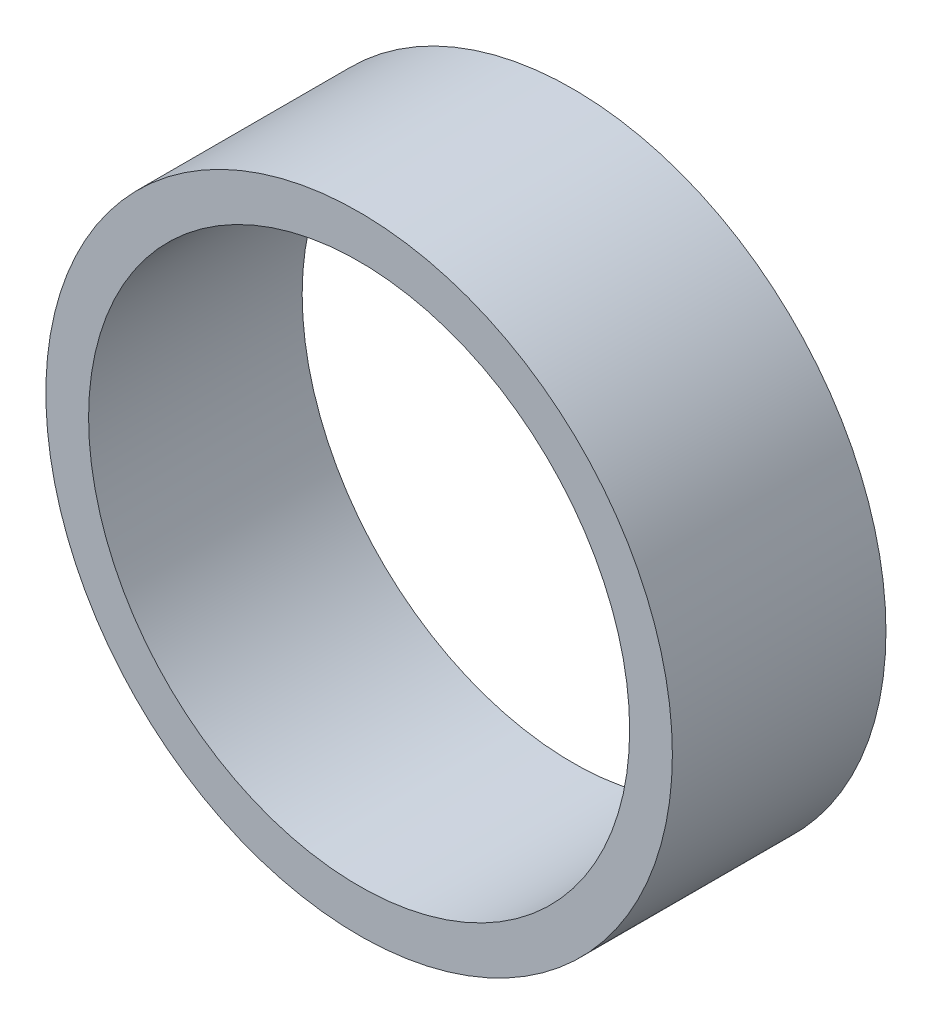
ISO-10303-21;
HEADER;
FILE_DESCRIPTION(('STEP AP214'),'2;1');
FILE_NAME('part.step','',(''),(''),'','','');
FILE_SCHEMA(('AUTOMOTIVE_DESIGN { 1 0 10303 214 1 1 1 1 }'));
ENDSEC;
DATA;
#1=APPLICATION_CONTEXT('core data for automotive mechanical design processes');
#2=APPLICATION_PROTOCOL_DEFINITION('international standard','automotive_design',2000,#1);
#3=PRODUCT_CONTEXT('',#1,'mechanical');
#4=PRODUCT('Part','Part','',(#3));
#5=PRODUCT_RELATED_PRODUCT_CATEGORY('part','',(#4));
#6=PRODUCT_DEFINITION_FORMATION('','',#4);
#7=PRODUCT_DEFINITION_CONTEXT('part definition',#1,'design');
#8=PRODUCT_DEFINITION('design','',#6,#7);
#9=PRODUCT_DEFINITION_SHAPE('','',#8);
#10=(LENGTH_UNIT() NAMED_UNIT(*) SI_UNIT(.MILLI.,.METRE.));
#11=(NAMED_UNIT(*) PLANE_ANGLE_UNIT() SI_UNIT($,.RADIAN.));
#12=(NAMED_UNIT(*) SI_UNIT($,.STERADIAN.) SOLID_ANGLE_UNIT());
#13=UNCERTAINTY_MEASURE_WITH_UNIT(LENGTH_MEASURE(1.E-05),#10,'distance_accuracy_value','');
#14=(GEOMETRIC_REPRESENTATION_CONTEXT(3) GLOBAL_UNCERTAINTY_ASSIGNED_CONTEXT((#13)) GLOBAL_UNIT_ASSIGNED_CONTEXT((#10,
#11,#12)) REPRESENTATION_CONTEXT('',''));
#15=CARTESIAN_POINT('',(0.,0.,0.));
#16=DIRECTION('',(0.,0.,1.));
#17=DIRECTION('',(1.,0.,0.));
#18=AXIS2_PLACEMENT_3D('',#15,#16,#17);
#19=CARTESIAN_POINT('',(0.,0.,15.));
#20=DIRECTION('',(0.,0.,1.));
#21=DIRECTION('',(1.,0.,0.));
#22=AXIS2_PLACEMENT_3D('',#19,#20,#21);
#23=PLANE('',#22);
#24=CARTESIAN_POINT('',(0.,0.,15.));
#25=DIRECTION('',(0.,0.,1.));
#26=DIRECTION('',(1.,0.,0.));
#27=AXIS2_PLACEMENT_3D('',#24,#25,#26);
#28=CIRCLE('',#27,22.);
#29=CARTESIAN_POINT('',(22.,0.,15.));
#30=VERTEX_POINT('',#29);
#31=EDGE_CURVE('E10',#30,#30,#28,.T.);
#32=ORIENTED_EDGE('',*,*,#31,.T.);
#33=EDGE_LOOP('',(#32));
#34=FACE_BOUND('',#33,.T.);
#35=CARTESIAN_POINT('',(0.,0.,15.));
#36=DIRECTION('',(0.,0.,1.));
#37=DIRECTION('',(1.,0.,0.));
#38=AXIS2_PLACEMENT_3D('',#35,#36,#37);
#39=CIRCLE('',#38,19.);
#40=CARTESIAN_POINT('',(19.,0.,15.));
#41=VERTEX_POINT('',#40);
#42=EDGE_CURVE('E50',#41,#41,#39,.T.);
#43=ORIENTED_EDGE('',*,*,#42,.F.);
#44=EDGE_LOOP('',(#43));
#45=FACE_BOUND('',#44,.T.);
#46=ADVANCED_FACE('F37',(#34,#45),#23,.T.);
#47=CARTESIAN_POINT('',(0.,0.,0.));
#48=DIRECTION('',(0.,0.,1.));
#49=DIRECTION('',(1.,0.,0.));
#50=AXIS2_PLACEMENT_3D('',#47,#48,#49);
#51=PLANE('',#50);
#52=CARTESIAN_POINT('',(0.,0.,0.));
#53=DIRECTION('',(0.,0.,1.));
#54=DIRECTION('',(1.,0.,0.));
#55=AXIS2_PLACEMENT_3D('',#52,#53,#54);
#56=CIRCLE('',#55,22.);
#57=CARTESIAN_POINT('',(22.,0.,0.));
#58=VERTEX_POINT('',#57);
#59=EDGE_CURVE('E41',#58,#58,#56,.T.);
#60=ORIENTED_EDGE('',*,*,#59,.F.);
#61=EDGE_LOOP('',(#60));
#62=FACE_BOUND('',#61,.T.);
#63=CARTESIAN_POINT('',(0.,0.,0.));
#64=DIRECTION('',(0.,0.,1.));
#65=DIRECTION('',(1.,0.,0.));
#66=AXIS2_PLACEMENT_3D('',#63,#64,#65);
#67=CIRCLE('',#66,19.);
#68=CARTESIAN_POINT('',(19.,0.,0.));
#69=VERTEX_POINT('',#68);
#70=EDGE_CURVE('E52',#69,#69,#67,.T.);
#71=ORIENTED_EDGE('',*,*,#70,.T.);
#72=EDGE_LOOP('',(#71));
#73=FACE_BOUND('',#72,.T.);
#74=ADVANCED_FACE('F64',(#62,#73),#51,.F.);
#75=CARTESIAN_POINT('',(0.,0.,15.));
#76=DIRECTION('',(0.,0.,-1.));
#77=DIRECTION('',(-1.,0.,0.));
#78=AXIS2_PLACEMENT_3D('',#75,#76,#77);
#79=CYLINDRICAL_SURFACE('',#78,22.);
#80=ORIENTED_EDGE('',*,*,#31,.F.);
#81=EDGE_LOOP('',(#80));
#82=FACE_BOUND('',#81,.T.);
#83=ORIENTED_EDGE('',*,*,#59,.T.);
#84=EDGE_LOOP('',(#83));
#85=FACE_BOUND('',#84,.T.);
#86=ADVANCED_FACE('F39',(#82,#85),#79,.T.);
#87=CARTESIAN_POINT('',(0.,0.,15.));
#88=DIRECTION('',(0.,0.,-1.));
#89=DIRECTION('',(-1.,0.,0.));
#90=AXIS2_PLACEMENT_3D('',#87,#88,#89);
#91=CYLINDRICAL_SURFACE('',#90,19.);
#92=ORIENTED_EDGE('',*,*,#42,.T.);
#93=EDGE_LOOP('',(#92));
#94=FACE_BOUND('',#93,.T.);
#95=ORIENTED_EDGE('',*,*,#70,.F.);
#96=EDGE_LOOP('',(#95));
#97=FACE_BOUND('',#96,.T.);
#98=ADVANCED_FACE('F60',(#94,#97),#91,.F.);
#99=CLOSED_SHELL('',(#46,#74,#86,#98));
#100=MANIFOLD_SOLID_BREP('B2',#99);
#101=ADVANCED_BREP_SHAPE_REPRESENTATION('',(#18,#100),#14);
#102=SHAPE_DEFINITION_REPRESENTATION(#9,#101);
ENDSEC;
END-ISO-10303-21;
